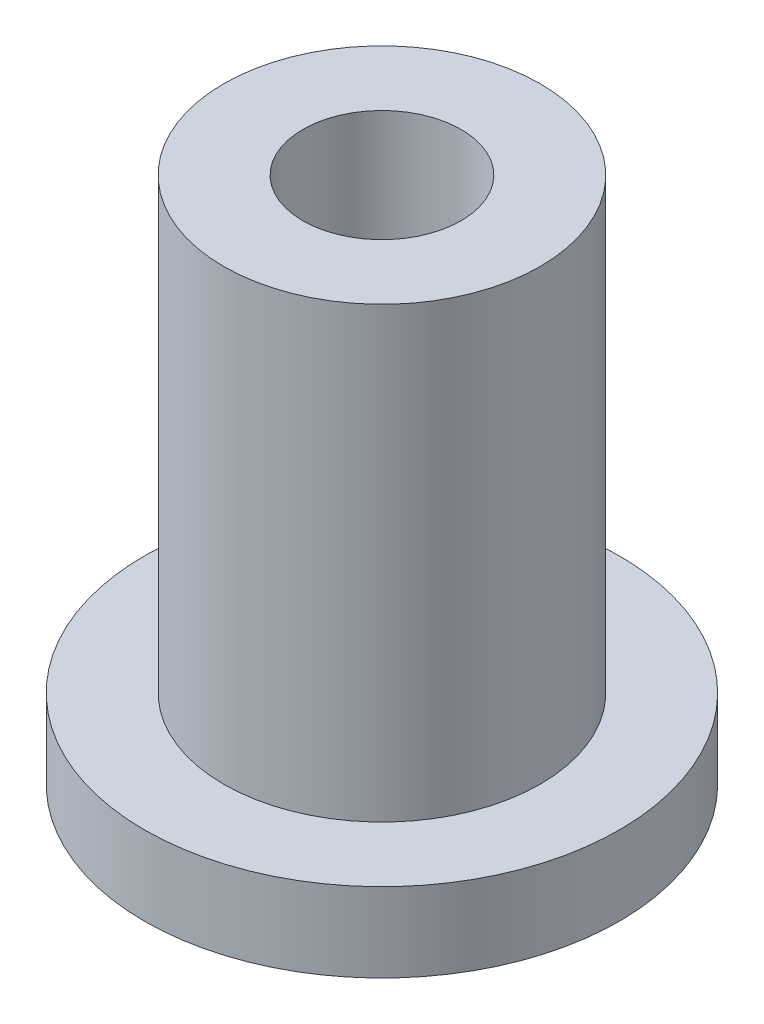
ISO-10303-21;
HEADER;
FILE_DESCRIPTION(('STEP AP214'),'2;1');
FILE_NAME('part.step','',(''),(''),'','','');
FILE_SCHEMA(('AUTOMOTIVE_DESIGN { 1 0 10303 214 1 1 1 1 }'));
ENDSEC;
DATA;
#1=APPLICATION_CONTEXT('core data for automotive mechanical design processes');
#2=APPLICATION_PROTOCOL_DEFINITION('international standard','automotive_design',2000,#1);
#3=PRODUCT_CONTEXT('',#1,'mechanical');
#4=PRODUCT('Part','Part','',(#3));
#5=PRODUCT_RELATED_PRODUCT_CATEGORY('part','',(#4));
#6=PRODUCT_DEFINITION_FORMATION('','',#4);
#7=PRODUCT_DEFINITION_CONTEXT('part definition',#1,'design');
#8=PRODUCT_DEFINITION('design','',#6,#7);
#9=PRODUCT_DEFINITION_SHAPE('','',#8);
#10=(LENGTH_UNIT() NAMED_UNIT(*) SI_UNIT(.MILLI.,.METRE.));
#11=(NAMED_UNIT(*) PLANE_ANGLE_UNIT() SI_UNIT($,.RADIAN.));
#12=(NAMED_UNIT(*) SI_UNIT($,.STERADIAN.) SOLID_ANGLE_UNIT());
#13=UNCERTAINTY_MEASURE_WITH_UNIT(LENGTH_MEASURE(1.E-05),#10,'distance_accuracy_value','');
#14=(GEOMETRIC_REPRESENTATION_CONTEXT(3) GLOBAL_UNCERTAINTY_ASSIGNED_CONTEXT((#13)) GLOBAL_UNIT_ASSIGNED_CONTEXT((#10,
#11,#12)) REPRESENTATION_CONTEXT('',''));
#15=CARTESIAN_POINT('',(0.,0.,0.));
#16=DIRECTION('',(0.,0.,1.));
#17=DIRECTION('',(1.,0.,0.));
#18=AXIS2_PLACEMENT_3D('',#15,#16,#17);
#19=CARTESIAN_POINT('',(0.,1.5,0.));
#20=DIRECTION('',(0.,1.,0.));
#21=DIRECTION('',(0.,0.,1.));
#22=AXIS2_PLACEMENT_3D('',#19,#20,#21);
#23=PLANE('',#22);
#24=CARTESIAN_POINT('',(0.,1.5,0.));
#25=DIRECTION('',(0.,1.,0.));
#26=DIRECTION('',(0.,0.,1.));
#27=AXIS2_PLACEMENT_3D('',#24,#25,#26);
#28=CIRCLE('',#27,4.5);
#29=CARTESIAN_POINT('',(0.,1.5,4.5));
#30=VERTEX_POINT('',#29);
#31=EDGE_CURVE('E10',#30,#30,#28,.T.);
#32=ORIENTED_EDGE('',*,*,#31,.T.);
#33=EDGE_LOOP('',(#32));
#34=FACE_BOUND('',#33,.T.);
#35=CARTESIAN_POINT('',(0.,1.5,0.));
#36=DIRECTION('',(0.,1.,0.));
#37=DIRECTION('',(0.,0.,1.));
#38=AXIS2_PLACEMENT_3D('',#35,#36,#37);
#39=CIRCLE('',#38,3.);
#40=CARTESIAN_POINT('',(0.,1.5,3.));
#41=VERTEX_POINT('',#40);
#42=EDGE_CURVE('E50',#41,#41,#39,.T.);
#43=ORIENTED_EDGE('',*,*,#42,.F.);
#44=EDGE_LOOP('',(#43));
#45=FACE_BOUND('',#44,.T.);
#46=ADVANCED_FACE('F34',(#34,#45),#23,.T.);
#47=CARTESIAN_POINT('',(0.,0.,0.));
#48=DIRECTION('',(0.,1.,0.));
#49=DIRECTION('',(0.,0.,1.));
#50=AXIS2_PLACEMENT_3D('',#47,#48,#49);
#51=PLANE('',#50);
#52=CARTESIAN_POINT('',(0.,0.,0.));
#53=DIRECTION('',(0.,1.,0.));
#54=DIRECTION('',(0.,0.,1.));
#55=AXIS2_PLACEMENT_3D('',#52,#53,#54);
#56=CIRCLE('',#55,4.5);
#57=CARTESIAN_POINT('',(0.,0.,4.5));
#58=VERTEX_POINT('',#57);
#59=EDGE_CURVE('E38',#58,#58,#56,.T.);
#60=ORIENTED_EDGE('',*,*,#59,.F.);
#61=EDGE_LOOP('',(#60));
#62=FACE_BOUND('',#61,.T.);
#63=CARTESIAN_POINT('',(0.,0.,0.));
#64=DIRECTION('',(0.,1.,0.));
#65=DIRECTION('',(0.,0.,1.));
#66=AXIS2_PLACEMENT_3D('',#63,#64,#65);
#67=CIRCLE('',#66,1.5);
#68=CARTESIAN_POINT('',(0.,0.,1.5));
#69=VERTEX_POINT('',#68);
#70=EDGE_CURVE('E45',#69,#69,#67,.T.);
#71=ORIENTED_EDGE('',*,*,#70,.T.);
#72=EDGE_LOOP('',(#71));
#73=FACE_BOUND('',#72,.T.);
#74=ADVANCED_FACE('F75',(#62,#73),#51,.F.);
#75=CARTESIAN_POINT('',(0.,1.5,0.));
#76=DIRECTION('',(0.,-1.,0.));
#77=DIRECTION('',(0.,0.,-1.));
#78=AXIS2_PLACEMENT_3D('',#75,#76,#77);
#79=CYLINDRICAL_SURFACE('',#78,4.5);
#80=ORIENTED_EDGE('',*,*,#31,.F.);
#81=EDGE_LOOP('',(#80));
#82=FACE_BOUND('',#81,.T.);
#83=ORIENTED_EDGE('',*,*,#59,.T.);
#84=EDGE_LOOP('',(#83));
#85=FACE_BOUND('',#84,.T.);
#86=ADVANCED_FACE('F36',(#82,#85),#79,.T.);
#87=CARTESIAN_POINT('',(0.,1.5,0.));
#88=DIRECTION('',(0.,-1.,0.));
#89=DIRECTION('',(0.,0.,-1.));
#90=AXIS2_PLACEMENT_3D('',#87,#88,#89);
#91=CYLINDRICAL_SURFACE('',#90,1.5);
#92=ORIENTED_EDGE('',*,*,#70,.F.);
#93=EDGE_LOOP('',(#92));
#94=FACE_BOUND('',#93,.T.);
#95=CARTESIAN_POINT('',(0.,10.,0.));
#96=DIRECTION('',(0.,1.,0.));
#97=DIRECTION('',(0.,0.,1.));
#98=AXIS2_PLACEMENT_3D('',#95,#96,#97);
#99=CIRCLE('',#98,1.5);
#100=CARTESIAN_POINT('',(0.,10.,1.5));
#101=VERTEX_POINT('',#100);
#102=EDGE_CURVE('E53',#101,#101,#99,.T.);
#103=ORIENTED_EDGE('',*,*,#102,.T.);
#104=EDGE_LOOP('',(#103));
#105=FACE_BOUND('',#104,.T.);
#106=ADVANCED_FACE('F59',(#94,#105),#91,.F.);
#107=CARTESIAN_POINT('',(0.,10.,0.));
#108=DIRECTION('',(0.,1.,0.));
#109=DIRECTION('',(0.,0.,1.));
#110=AXIS2_PLACEMENT_3D('',#107,#108,#109);
#111=PLANE('',#110);
#112=CARTESIAN_POINT('',(0.,10.,0.));
#113=DIRECTION('',(0.,1.,0.));
#114=DIRECTION('',(0.,0.,1.));
#115=AXIS2_PLACEMENT_3D('',#112,#113,#114);
#116=CIRCLE('',#115,3.);
#117=CARTESIAN_POINT('',(0.,10.,3.));
#118=VERTEX_POINT('',#117);
#119=EDGE_CURVE('E49',#118,#118,#116,.T.);
#120=ORIENTED_EDGE('',*,*,#119,.T.);
#121=EDGE_LOOP('',(#120));
#122=FACE_BOUND('',#121,.T.);
#123=ORIENTED_EDGE('',*,*,#102,.F.);
#124=EDGE_LOOP('',(#123));
#125=FACE_BOUND('',#124,.T.);
#126=ADVANCED_FACE('F61',(#122,#125),#111,.T.);
#127=CARTESIAN_POINT('',(0.,10.,0.));
#128=DIRECTION('',(0.,-1.,0.));
#129=DIRECTION('',(0.,0.,-1.));
#130=AXIS2_PLACEMENT_3D('',#127,#128,#129);
#131=CYLINDRICAL_SURFACE('',#130,3.);
#132=ORIENTED_EDGE('',*,*,#119,.F.);
#133=EDGE_LOOP('',(#132));
#134=FACE_BOUND('',#133,.T.);
#135=ORIENTED_EDGE('',*,*,#42,.T.);
#136=EDGE_LOOP('',(#135));
#137=FACE_BOUND('',#136,.T.);
#138=ADVANCED_FACE('F63',(#134,#137),#131,.T.);
#139=CLOSED_SHELL('',(#46,#74,#86,#106,#126,#138));
#140=MANIFOLD_SOLID_BREP('B2',#139);
#141=ADVANCED_BREP_SHAPE_REPRESENTATION('',(#18,#140),#14);
#142=SHAPE_DEFINITION_REPRESENTATION(#9,#141);
ENDSEC;
END-ISO-10303-21;
